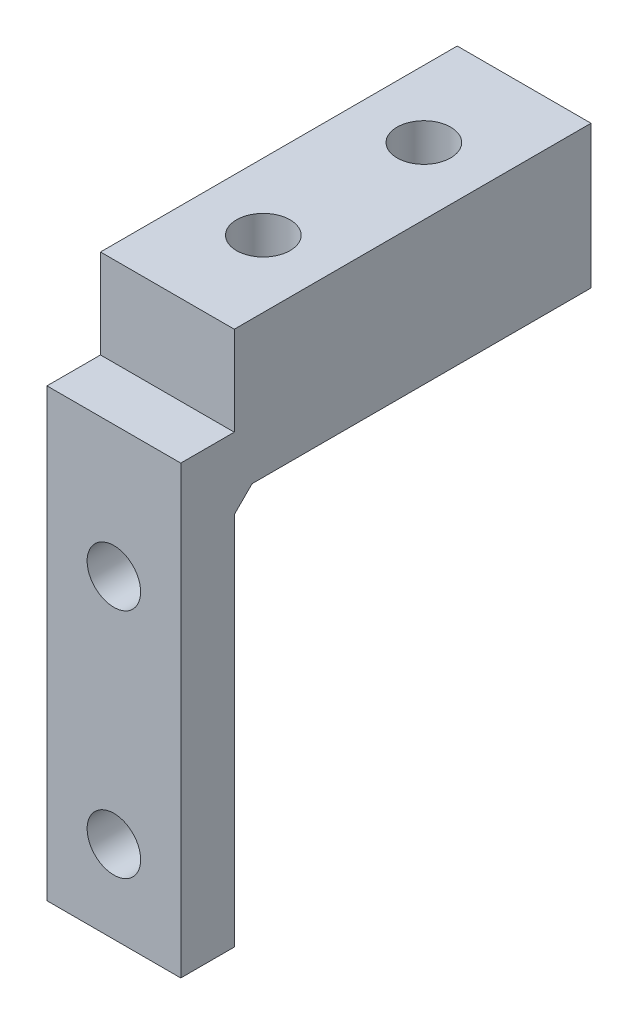
ISO-10303-21;
HEADER;
FILE_DESCRIPTION(('STEP AP214'),'2;1');
FILE_NAME('part.step','',(''),(''),'','','');
FILE_SCHEMA(('AUTOMOTIVE_DESIGN { 1 0 10303 214 1 1 1 1 }'));
ENDSEC;
DATA;
#1=APPLICATION_CONTEXT('core data for automotive mechanical design processes');
#2=APPLICATION_PROTOCOL_DEFINITION('international standard','automotive_design',2000,#1);
#3=PRODUCT_CONTEXT('',#1,'mechanical');
#4=PRODUCT('Part','Part','',(#3));
#5=PRODUCT_RELATED_PRODUCT_CATEGORY('part','',(#4));
#6=PRODUCT_DEFINITION_FORMATION('','',#4);
#7=PRODUCT_DEFINITION_CONTEXT('part definition',#1,'design');
#8=PRODUCT_DEFINITION('design','',#6,#7);
#9=PRODUCT_DEFINITION_SHAPE('','',#8);
#10=(LENGTH_UNIT() NAMED_UNIT(*) SI_UNIT(.MILLI.,.METRE.));
#11=(NAMED_UNIT(*) PLANE_ANGLE_UNIT() SI_UNIT($,.RADIAN.));
#12=(NAMED_UNIT(*) SI_UNIT($,.STERADIAN.) SOLID_ANGLE_UNIT());
#13=UNCERTAINTY_MEASURE_WITH_UNIT(LENGTH_MEASURE(1.E-05),#10,'distance_accuracy_value','');
#14=(GEOMETRIC_REPRESENTATION_CONTEXT(3) GLOBAL_UNCERTAINTY_ASSIGNED_CONTEXT((#13)) GLOBAL_UNIT_ASSIGNED_CONTEXT((#10,
#11,#12)) REPRESENTATION_CONTEXT('',''));
#15=CARTESIAN_POINT('',(0.,0.,0.));
#16=DIRECTION('',(0.,0.,1.));
#17=DIRECTION('',(1.,0.,0.));
#18=AXIS2_PLACEMENT_3D('',#15,#16,#17);
#19=CARTESIAN_POINT('',(17.7401409776573,2.32150758974876,-17.377692950586));
#20=DIRECTION('',(-4.94162912521759E-09,-1.,0.));
#21=DIRECTION('',(-1.,4.94162912521759E-09,0.));
#22=AXIS2_PLACEMENT_3D('',#19,#20,#21);
#23=CYLINDRICAL_SURFACE('',#22,1.5);
#24=CARTESIAN_POINT('',(17.7401409381243,-5.67849241025123,-17.3776929505858));
#25=DIRECTION('',(4.94162681225285E-09,1.,0.));
#26=DIRECTION('',(0.,0.,1.));
#27=AXIS2_PLACEMENT_3D('',#24,#25,#26);
#28=CIRCLE('',#27,1.49999999999998);
#29=CARTESIAN_POINT('',(17.7401409381243,-5.6784924102512,-15.8776929505858));
#30=VERTEX_POINT('',#29);
#31=EDGE_CURVE('E180',#30,#30,#28,.T.);
#32=ORIENTED_EDGE('',*,*,#31,.F.);
#33=DIRECTION('',(4.9416258003309E-09,1.,0.));
#34=VECTOR('',#33,1.);
#35=CARTESIAN_POINT('',(17.7401409578908,-1.6784924102512,-15.8776929505859));
#36=LINE('',#35,#34);
#37=CARTESIAN_POINT('',(17.7401409776573,2.32150758974879,-15.877692950586));
#38=VERTEX_POINT('',#37);
#39=EDGE_CURVE('E11',#30,#38,#36,.T.);
#40=ORIENTED_EDGE('',*,*,#39,.T.);
#41=CARTESIAN_POINT('',(17.7401409776573,2.32150758974876,-17.377692950586));
#42=DIRECTION('',(-4.94162652313236E-09,-1.,0.));
#43=DIRECTION('',(0.,0.,1.));
#44=AXIS2_PLACEMENT_3D('',#41,#42,#43);
#45=CIRCLE('',#44,1.5);
#46=EDGE_CURVE('E51',#38,#38,#45,.T.);
#47=ORIENTED_EDGE('',*,*,#46,.F.);
#48=ORIENTED_EDGE('',*,*,#39,.F.);
#49=EDGE_LOOP('',(#32,#40,#47,#48));
#50=FACE_BOUND('',#49,.T.);
#51=ADVANCED_FACE('F40',(#50),#23,.F.);
#52=CARTESIAN_POINT('',(13.9899028314246,2.33150760828143,0.00999988247295892));
#53=DIRECTION('',(-1.,4.94162721415864E-09,0.));
#54=DIRECTION('',(0.,0.,-1.));
#55=AXIS2_PLACEMENT_3D('',#52,#53,#54);
#56=PLANE('',#55);
#57=DIRECTION('',(-4.9416212938464E-09,-1.,0.));
#58=VECTOR('',#57,1.);
#59=CARTESIAN_POINT('',(13.9899028190211,-0.178492258156639,-3.));
#60=LINE('',#59,#58);
#61=CARTESIAN_POINT('',(13.9899028313752,2.32150760828137,-3.));
#62=VERTEX_POINT('',#61);
#63=CARTESIAN_POINT('',(13.9899028313752,-2.67849212459464,-3.00000011752693));
#64=VERTEX_POINT('',#63);
#65=EDGE_CURVE('E333',#62,#64,#60,.T.);
#66=ORIENTED_EDGE('',*,*,#65,.F.);
#67=DIRECTION('',(0.,0.,1.));
#68=VECTOR('',#67,1.);
#69=CARTESIAN_POINT('',(13.9899028313752,2.32150760828114,-12.999846475293));
#70=LINE('',#69,#68);
#71=CARTESIAN_POINT('',(13.9899028313752,2.32150760828091,-22.999692950586));
#72=VERTEX_POINT('',#71);
#73=EDGE_CURVE('E353',#72,#62,#70,.T.);
#74=ORIENTED_EDGE('',*,*,#73,.F.);
#75=DIRECTION('',(-4.94162601717133E-09,-1.,0.));
#76=VECTOR('',#75,1.);
#77=CARTESIAN_POINT('',(13.9899028116087,-1.67849239171909,-22.9996929505859));
#78=LINE('',#77,#76);
#79=CARTESIAN_POINT('',(13.9899027918422,-5.67849239171908,-22.9996929505858));
#80=VERTEX_POINT('',#79);
#81=EDGE_CURVE('E219',#72,#80,#78,.T.);
#82=ORIENTED_EDGE('',*,*,#81,.T.);
#83=DIRECTION('',(0.,0.,-1.));
#84=VECTOR('',#83,1.);
#85=CARTESIAN_POINT('',(13.9899027918422,-5.67849239171887,-13.4998464752929));
#86=LINE('',#85,#84);
#87=CARTESIAN_POINT('',(13.9899027918422,-5.67849239171865,-4.));
#88=VERTEX_POINT('',#87);
#89=EDGE_CURVE('E189',#88,#80,#86,.T.);
#90=ORIENTED_EDGE('',*,*,#89,.F.);
#91=DIRECTION('',(3.49423922597153E-09,0.707106822738547,-0.707106739634545));
#92=VECTOR('',#91,1.);
#93=CARTESIAN_POINT('',(13.9899027893714,-6.17849239171864,-3.50000005876341));
#94=LINE('',#93,#92);
#95=CARTESIAN_POINT('',(13.9899028116087,-6.67849239171862,-3.00000011752683));
#96=VERTEX_POINT('',#95);
#97=EDGE_CURVE('E44',#96,#88,#94,.T.);
#98=ORIENTED_EDGE('',*,*,#97,.F.);
#99=DIRECTION('',(4.94162565754752E-09,1.,0.));
#100=VECTOR('',#99,1.);
#101=CARTESIAN_POINT('',(13.9899027597224,-17.1783388065658,-3.00000011752659));
#102=LINE('',#101,#100);
#103=CARTESIAN_POINT('',(13.9899027078361,-27.6781852214129,-3.00000011752635));
#104=VERTEX_POINT('',#103);
#105=EDGE_CURVE('E165',#104,#96,#102,.T.);
#106=ORIENTED_EDGE('',*,*,#105,.F.);
#107=DIRECTION('',(0.,0.,1.));
#108=VECTOR('',#107,1.);
#109=CARTESIAN_POINT('',(13.9899026831279,-27.6781852214129,-1.50000011752635));
#110=LINE('',#109,#108);
#111=CARTESIAN_POINT('',(13.9899027078361,-27.6781852214128,-1.17526360704134E-07));
#112=VERTEX_POINT('',#111);
#113=EDGE_CURVE('E289',#104,#112,#110,.T.);
#114=ORIENTED_EDGE('',*,*,#113,.T.);
#115=DIRECTION('',(-4.94162569698124E-09,-1.,0.));
#116=VECTOR('',#115,1.);
#117=CARTESIAN_POINT('',(13.9899027696056,-15.1783386730037,-1.17526647216915E-07));
#118=LINE('',#117,#116);
#119=CARTESIAN_POINT('',(13.9899028313752,-2.67849212459464,-1.17526933767847E-07));
#120=VERTEX_POINT('',#119);
#121=EDGE_CURVE('E286',#120,#112,#118,.T.);
#122=ORIENTED_EDGE('',*,*,#121,.F.);
#123=DIRECTION('',(0.,0.,1.));
#124=VECTOR('',#123,1.);
#125=CARTESIAN_POINT('',(13.9899028313752,-2.67849212459464,-1.50000011752693));
#126=LINE('',#125,#124);
#127=EDGE_CURVE('E317',#64,#120,#126,.T.);
#128=ORIENTED_EDGE('',*,*,#127,.F.);
#129=EDGE_LOOP('',(#66,#74,#82,#90,#98,#106,#114,#122,#128));
#130=FACE_BOUND('',#129,.T.);
#131=ADVANCED_FACE('F216',(#130),#56,.T.);
#132=CARTESIAN_POINT('',(21.4999028313752,2.32150757116975,-2.99));
#133=DIRECTION('',(4.94162604715989E-09,1.,0.));
#134=DIRECTION('',(0.,0.,-1.));
#135=AXIS2_PLACEMENT_3D('',#132,#133,#134);
#136=PLANE('',#135);
#137=ORIENTED_EDGE('',*,*,#46,.T.);
#138=EDGE_LOOP('',(#137));
#139=FACE_BOUND('',#138,.T.);
#140=CARTESIAN_POINT('',(17.7401409776573,2.32150758974896,-8.37769295058599));
#141=DIRECTION('',(-4.94162970345868E-09,-1.,0.));
#142=DIRECTION('',(0.,0.,1.));
#143=AXIS2_PLACEMENT_3D('',#140,#141,#142);
#144=CIRCLE('',#143,1.5);
#145=CARTESIAN_POINT('',(17.7401409776573,2.32150758974899,-6.877692950586));
#146=VERTEX_POINT('',#145);
#147=EDGE_CURVE('E350',#146,#146,#144,.T.);
#148=ORIENTED_EDGE('',*,*,#147,.T.);
#149=EDGE_LOOP('',(#148));
#150=FACE_BOUND('',#149,.T.);
#151=DIRECTION('',(-1.,4.94162634965999E-09,0.));
#152=VECTOR('',#151,1.);
#153=CARTESIAN_POINT('',(17.7399028313752,2.32150758974981,-22.999692950586));
#154=LINE('',#153,#152);
#155=CARTESIAN_POINT('',(21.4899028313752,2.32150757121871,-22.999692950586));
#156=VERTEX_POINT('',#155);
#157=EDGE_CURVE('E344',#156,#72,#154,.T.);
#158=ORIENTED_EDGE('',*,*,#157,.T.);
#159=ORIENTED_EDGE('',*,*,#73,.T.);
#160=DIRECTION('',(-1.,4.94162767961466E-09,0.));
#161=VECTOR('',#160,1.);
#162=CARTESIAN_POINT('',(17.7399028313752,2.32150758975026,-3.));
#163=LINE('',#162,#161);
#164=CARTESIAN_POINT('',(21.4899028313752,2.32150757121916,-3.));
#165=VERTEX_POINT('',#164);
#166=EDGE_CURVE('E329',#165,#62,#163,.T.);
#167=ORIENTED_EDGE('',*,*,#166,.F.);
#168=DIRECTION('',(0.,0.,-1.));
#169=VECTOR('',#168,1.);
#170=CARTESIAN_POINT('',(21.4899028313752,2.32150757121893,-12.999846475293));
#171=LINE('',#170,#169);
#172=EDGE_CURVE('E339',#165,#156,#171,.T.);
#173=ORIENTED_EDGE('',*,*,#172,.T.);
#174=EDGE_LOOP('',(#158,#159,#167,#173));
#175=FACE_BOUND('',#174,.T.);
#176=ADVANCED_FACE('F236',(#139,#150,#175),#136,.T.);
#177=CARTESIAN_POINT('',(17.7401409776573,2.32150758974896,-8.37769295058601));
#178=DIRECTION('',(-4.94162739049412E-09,-1.,0.));
#179=DIRECTION('',(-1.,4.94162739049412E-09,0.));
#180=AXIS2_PLACEMENT_3D('',#177,#178,#179);
#181=CYLINDRICAL_SURFACE('',#180,1.5);
#182=CARTESIAN_POINT('',(17.7401409381243,-5.67849241025102,-8.37769295058583));
#183=DIRECTION('',(4.94162912521758E-09,1.,0.));
#184=DIRECTION('',(0.,0.,1.));
#185=AXIS2_PLACEMENT_3D('',#182,#183,#184);
#186=CIRCLE('',#185,1.50000000000001);
#187=CARTESIAN_POINT('',(17.7401409381243,-5.678492410251,-6.87769295058582));
#188=VERTEX_POINT('',#187);
#189=EDGE_CURVE('E176',#188,#188,#186,.T.);
#190=ORIENTED_EDGE('',*,*,#189,.F.);
#191=DIRECTION('',(4.9416258003309E-09,1.,0.));
#192=VECTOR('',#191,1.);
#193=CARTESIAN_POINT('',(17.7401409578908,-1.678492410251,-6.87769295058591));
#194=LINE('',#193,#192);
#195=EDGE_CURVE('E347',#188,#146,#194,.T.);
#196=ORIENTED_EDGE('',*,*,#195,.T.);
#197=ORIENTED_EDGE('',*,*,#147,.F.);
#198=ORIENTED_EDGE('',*,*,#195,.F.);
#199=EDGE_LOOP('',(#190,#196,#197,#198));
#200=FACE_BOUND('',#199,.T.);
#201=ADVANCED_FACE('F241',(#200),#181,.F.);
#202=CARTESIAN_POINT('',(13.9799028314246,2.33150760833033,-22.999692950586));
#203=DIRECTION('',(0.,0.,-1.));
#204=DIRECTION('',(1.,-4.94162731590712E-09,0.));
#205=AXIS2_PLACEMENT_3D('',#202,#203,#204);
#206=PLANE('',#205);
#207=DIRECTION('',(1.,-4.94162773743877E-09,0.));
#208=VECTOR('',#207,1.);
#209=CARTESIAN_POINT('',(17.7399027918422,-5.67849241025019,-22.9996929505858));
#210=LINE('',#209,#208);
#211=CARTESIAN_POINT('',(21.4899027918422,-5.67849242878129,-22.9996929505858));
#212=VERTEX_POINT('',#211);
#213=EDGE_CURVE('E186',#80,#212,#210,.T.);
#214=ORIENTED_EDGE('',*,*,#213,.F.);
#215=ORIENTED_EDGE('',*,*,#81,.F.);
#216=ORIENTED_EDGE('',*,*,#157,.F.);
#217=DIRECTION('',(4.94162580033089E-09,1.,0.));
#218=VECTOR('',#217,1.);
#219=CARTESIAN_POINT('',(21.4899028116087,-1.67849242878129,-22.9996929505859));
#220=LINE('',#219,#218);
#221=EDGE_CURVE('E336',#212,#156,#220,.T.);
#222=ORIENTED_EDGE('',*,*,#221,.F.);
#223=EDGE_LOOP('',(#214,#215,#216,#222));
#224=FACE_BOUND('',#223,.T.);
#225=ADVANCED_FACE('F245',(#224),#206,.T.);
#226=CARTESIAN_POINT('',(21.4899028314246,2.33150757121871,-23.009692950586));
#227=DIRECTION('',(1.,-4.94162715637246E-09,0.));
#228=DIRECTION('',(0.,0.,1.));
#229=AXIS2_PLACEMENT_3D('',#226,#227,#228);
#230=PLANE('',#229);
#231=ORIENTED_EDGE('',*,*,#221,.T.);
#232=ORIENTED_EDGE('',*,*,#172,.F.);
#233=DIRECTION('',(4.94162129384641E-09,1.,0.));
#234=VECTOR('',#233,1.);
#235=CARTESIAN_POINT('',(21.4899028190211,-0.178492295218842,-3.));
#236=LINE('',#235,#234);
#237=CARTESIAN_POINT('',(21.4899028313752,-2.67849216165684,-3.00000011752693));
#238=VERTEX_POINT('',#237);
#239=EDGE_CURVE('E325',#238,#165,#236,.T.);
#240=ORIENTED_EDGE('',*,*,#239,.F.);
#241=DIRECTION('',(0.,0.,-1.));
#242=VECTOR('',#241,1.);
#243=CARTESIAN_POINT('',(21.4899028313752,-2.67849216165684,-1.50000011752693));
#244=LINE('',#243,#242);
#245=CARTESIAN_POINT('',(21.4899028313752,-2.67849216165684,-1.17526933936711E-07));
#246=VERTEX_POINT('',#245);
#247=EDGE_CURVE('E295',#246,#238,#244,.T.);
#248=ORIENTED_EDGE('',*,*,#247,.F.);
#249=DIRECTION('',(4.94162562759145E-09,1.,0.));
#250=VECTOR('',#249,1.);
#251=CARTESIAN_POINT('',(21.4899027696056,-15.1783387100659,-1.17526647277088E-07));
#252=LINE('',#251,#250);
#253=CARTESIAN_POINT('',(21.4899027078361,-27.678185258475,-1.17526360734221E-07));
#254=VERTEX_POINT('',#253);
#255=EDGE_CURVE('E162',#254,#246,#252,.T.);
#256=ORIENTED_EDGE('',*,*,#255,.F.);
#257=DIRECTION('',(0.,0.,-1.));
#258=VECTOR('',#257,1.);
#259=CARTESIAN_POINT('',(21.4899026831279,-27.6781852584751,-1.50000011752635));
#260=LINE('',#259,#258);
#261=CARTESIAN_POINT('',(21.4899027078361,-27.6781852584751,-3.00000011752635));
#262=VERTEX_POINT('',#261);
#263=EDGE_CURVE('E147',#254,#262,#260,.T.);
#264=ORIENTED_EDGE('',*,*,#263,.T.);
#265=DIRECTION('',(-4.94162557494043E-09,-1.,0.));
#266=VECTOR('',#265,1.);
#267=CARTESIAN_POINT('',(21.4899027597224,-17.178338843628,-3.00000011752659));
#268=LINE('',#267,#266);
#269=CARTESIAN_POINT('',(21.4899028116087,-6.67849242878083,-3.00000011752683));
#270=VERTEX_POINT('',#269);
#271=EDGE_CURVE('E87',#270,#262,#268,.T.);
#272=ORIENTED_EDGE('',*,*,#271,.F.);
#273=DIRECTION('',(-3.49423922597151E-09,-0.707106822738551,0.707106739634542));
#274=VECTOR('',#273,1.);
#275=CARTESIAN_POINT('',(21.4899027893714,-6.17849242878084,-3.50000005876341));
#276=LINE('',#275,#274);
#277=CARTESIAN_POINT('',(21.4899027918422,-5.67849242878086,-4.));
#278=VERTEX_POINT('',#277);
#279=EDGE_CURVE('E197',#278,#270,#276,.T.);
#280=ORIENTED_EDGE('',*,*,#279,.F.);
#281=DIRECTION('',(0.,0.,1.));
#282=VECTOR('',#281,1.);
#283=CARTESIAN_POINT('',(21.4899027918422,-5.67849242878108,-13.4998464752929));
#284=LINE('',#283,#282);
#285=EDGE_CURVE('E98',#212,#278,#284,.T.);
#286=ORIENTED_EDGE('',*,*,#285,.F.);
#287=EDGE_LOOP('',(#231,#232,#240,#248,#256,#264,#272,#280,#286));
#288=FACE_BOUND('',#287,.T.);
#289=ADVANCED_FACE('F249',(#288),#230,.T.);
#290=CARTESIAN_POINT('',(13.9799028066671,2.33150760828137,-3.));
#291=DIRECTION('',(0.,0.,1.));
#292=DIRECTION('',(0.,-1.,0.));
#293=AXIS2_PLACEMENT_3D('',#290,#291,#292);
#294=PLANE('',#293);
#295=DIRECTION('',(1.,-4.94162634965999E-09,0.));
#296=VECTOR('',#295,1.);
#297=CARTESIAN_POINT('',(17.7399028313752,-2.67849214312574,-3.));
#298=LINE('',#297,#296);
#299=EDGE_CURVE('E313',#64,#238,#298,.T.);
#300=ORIENTED_EDGE('',*,*,#299,.T.);
#301=ORIENTED_EDGE('',*,*,#239,.T.);
#302=ORIENTED_EDGE('',*,*,#166,.T.);
#303=ORIENTED_EDGE('',*,*,#65,.T.);
#304=EDGE_LOOP('',(#300,#301,#302,#303));
#305=FACE_BOUND('',#304,.T.);
#306=ADVANCED_FACE('F253',(#305),#294,.T.);
#307=CARTESIAN_POINT('',(17.7401408917832,-23.0561852399452,-3.00000011752653));
#308=DIRECTION('',(0.,0.,1.));
#309=DIRECTION('',(0.,-1.,0.));
#310=AXIS2_PLACEMENT_3D('',#307,#308,#309);
#311=CYLINDRICAL_SURFACE('',#310,1.50000000000001);
#312=CARTESIAN_POINT('',(17.7401408917832,-23.0561852399451,-1.17526537390944E-07));
#313=DIRECTION('',(0.,0.,-1.));
#314=DIRECTION('',(4.94166150672241E-09,1.,0.));
#315=AXIS2_PLACEMENT_3D('',#312,#313,#314);
#316=CIRCLE('',#315,1.5);
#317=CARTESIAN_POINT('',(17.7401408991957,-21.5561852399451,-1.17526571807858E-07));
#318=VERTEX_POINT('',#317);
#319=EDGE_CURVE('E278',#318,#318,#316,.T.);
#320=ORIENTED_EDGE('',*,*,#319,.F.);
#321=DIRECTION('',(0.,0.,-1.));
#322=VECTOR('',#321,1.);
#323=CARTESIAN_POINT('',(17.7401408991957,-21.5561852399452,-1.50000011752657));
#324=LINE('',#323,#322);
#325=CARTESIAN_POINT('',(17.7401408991957,-21.5561852399452,-3.00000011752656));
#326=VERTEX_POINT('',#325);
#327=EDGE_CURVE('E146',#318,#326,#324,.T.);
#328=ORIENTED_EDGE('',*,*,#327,.T.);
#329=CARTESIAN_POINT('',(17.7401408917832,-23.0561852399452,-3.00000011752653));
#330=DIRECTION('',(0.,0.,1.));
#331=DIRECTION('',(4.94165919375782E-09,1.,0.));
#332=AXIS2_PLACEMENT_3D('',#329,#330,#331);
#333=CIRCLE('',#332,1.5);
#334=EDGE_CURVE('E154',#326,#326,#333,.T.);
#335=ORIENTED_EDGE('',*,*,#334,.F.);
#336=ORIENTED_EDGE('',*,*,#327,.F.);
#337=EDGE_LOOP('',(#320,#328,#335,#336));
#338=FACE_BOUND('',#337,.T.);
#339=ADVANCED_FACE('F256',(#338),#311,.F.);
#340=CARTESIAN_POINT('',(17.7401409362578,-10.0561852399451,-3.00000011752674));
#341=DIRECTION('',(0.,0.,1.));
#342=DIRECTION('',(0.,-1.,0.));
#343=AXIS2_PLACEMENT_3D('',#340,#341,#342);
#344=CYLINDRICAL_SURFACE('',#343,1.49999999999994);
#345=CARTESIAN_POINT('',(17.7401409362578,-10.0561852399451,-1.17526742782203E-07));
#346=DIRECTION('',(0.,0.,-1.));
#347=DIRECTION('',(4.94163143818221E-09,1.,0.));
#348=AXIS2_PLACEMENT_3D('',#345,#346,#347);
#349=CIRCLE('',#348,1.50000000000002);
#350=CARTESIAN_POINT('',(17.7401409436703,-8.55618523994513,-1.17526777199117E-07));
#351=VERTEX_POINT('',#350);
#352=EDGE_CURVE('E144',#351,#351,#349,.T.);
#353=ORIENTED_EDGE('',*,*,#352,.F.);
#354=DIRECTION('',(0.,0.,-1.));
#355=VECTOR('',#354,1.);
#356=CARTESIAN_POINT('',(17.7401409436703,-8.55618523994516,-1.50000011752677));
#357=LINE('',#356,#355);
#358=CARTESIAN_POINT('',(17.7401409436703,-8.5561852399452,-3.00000011752677));
#359=VERTEX_POINT('',#358);
#360=EDGE_CURVE('E139',#351,#359,#357,.T.);
#361=ORIENTED_EDGE('',*,*,#360,.T.);
#362=CARTESIAN_POINT('',(17.7401409362578,-10.0561852399451,-3.00000011752674));
#363=DIRECTION('',(0.,0.,1.));
#364=DIRECTION('',(4.94162912521781E-09,1.,0.));
#365=AXIS2_PLACEMENT_3D('',#362,#363,#364);
#366=CIRCLE('',#365,1.49999999999994);
#367=EDGE_CURVE('E142',#359,#359,#366,.T.);
#368=ORIENTED_EDGE('',*,*,#367,.F.);
#369=ORIENTED_EDGE('',*,*,#360,.F.);
#370=EDGE_LOOP('',(#353,#361,#368,#369));
#371=FACE_BOUND('',#370,.T.);
#372=ADVANCED_FACE('F141',(#371),#344,.F.);
#373=CARTESIAN_POINT('',(13.9799026831279,-27.6781852213635,-3.01000011752635));
#374=DIRECTION('',(-4.94162332041795E-09,-1.,0.));
#375=DIRECTION('',(1.,-4.94162332041795E-09,0.));
#376=AXIS2_PLACEMENT_3D('',#373,#374,#375);
#377=PLANE('',#376);
#378=DIRECTION('',(1.,-4.94162773743877E-09,0.));
#379=VECTOR('',#378,1.);
#380=CARTESIAN_POINT('',(17.7399027078361,-27.6781852399439,-1.17526360292053E-07));
#381=LINE('',#380,#379);
#382=EDGE_CURVE('E153',#112,#254,#381,.T.);
#383=ORIENTED_EDGE('',*,*,#382,.F.);
#384=ORIENTED_EDGE('',*,*,#113,.F.);
#385=DIRECTION('',(-1.,4.94162773743877E-09,0.));
#386=VECTOR('',#385,1.);
#387=CARTESIAN_POINT('',(17.7399027078361,-27.678185239944,-3.00000011752635));
#388=LINE('',#387,#386);
#389=EDGE_CURVE('E171',#262,#104,#388,.T.);
#390=ORIENTED_EDGE('',*,*,#389,.F.);
#391=ORIENTED_EDGE('',*,*,#263,.F.);
#392=EDGE_LOOP('',(#383,#384,#390,#391));
#393=FACE_BOUND('',#392,.T.);
#394=ADVANCED_FACE('F263',(#393),#377,.T.);
#395=CARTESIAN_POINT('',(13.9799028165009,-2.67849212454522,-3.01000011747751));
#396=DIRECTION('',(4.94162730616522E-09,1.,0.));
#397=DIRECTION('',(4.94162226684351E-09,0.,1.));
#398=AXIS2_PLACEMENT_3D('',#395,#396,#397);
#399=PLANE('',#398);
#400=DIRECTION('',(1.,-4.94162634965999E-09,0.));
#401=VECTOR('',#400,1.);
#402=CARTESIAN_POINT('',(17.7399028313752,-2.67849214312574,-1.17526934150672E-07));
#403=LINE('',#402,#401);
#404=EDGE_CURVE('E298',#120,#246,#403,.T.);
#405=ORIENTED_EDGE('',*,*,#404,.T.);
#406=ORIENTED_EDGE('',*,*,#247,.T.);
#407=ORIENTED_EDGE('',*,*,#299,.F.);
#408=ORIENTED_EDGE('',*,*,#127,.T.);
#409=EDGE_LOOP('',(#405,#406,#407,#408));
#410=FACE_BOUND('',#409,.T.);
#411=ADVANCED_FACE('F266',(#410),#399,.T.);
#412=CARTESIAN_POINT('',(21.4999027077867,-27.6881852585244,-1.175263602492E-07));
#413=DIRECTION('',(0.,0.,1.));
#414=DIRECTION('',(4.94162444523266E-09,1.,0.));
#415=AXIS2_PLACEMENT_3D('',#412,#413,#414);
#416=PLANE('',#415);
#417=ORIENTED_EDGE('',*,*,#319,.T.);
#418=EDGE_LOOP('',(#417));
#419=FACE_BOUND('',#418,.T.);
#420=ORIENTED_EDGE('',*,*,#352,.T.);
#421=EDGE_LOOP('',(#420));
#422=FACE_BOUND('',#421,.T.);
#423=ORIENTED_EDGE('',*,*,#382,.T.);
#424=ORIENTED_EDGE('',*,*,#255,.T.);
#425=ORIENTED_EDGE('',*,*,#404,.F.);
#426=ORIENTED_EDGE('',*,*,#121,.T.);
#427=EDGE_LOOP('',(#423,#424,#425,#426));
#428=FACE_BOUND('',#427,.T.);
#429=ADVANCED_FACE('F228',(#419,#422,#428),#416,.T.);
#430=CARTESIAN_POINT('',(21.4999028116581,-6.66849242883024,-3.00000011752683));
#431=DIRECTION('',(0.,0.,-1.));
#432=DIRECTION('',(-4.9416243326885E-09,-1.,0.));
#433=AXIS2_PLACEMENT_3D('',#430,#431,#432);
#434=PLANE('',#433);
#435=ORIENTED_EDGE('',*,*,#367,.T.);
#436=EDGE_LOOP('',(#435));
#437=FACE_BOUND('',#436,.T.);
#438=ORIENTED_EDGE('',*,*,#334,.T.);
#439=EDGE_LOOP('',(#438));
#440=FACE_BOUND('',#439,.T.);
#441=DIRECTION('',(-1.,4.941627853087E-09,0.));
#442=VECTOR('',#441,1.);
#443=CARTESIAN_POINT('',(17.7399028116087,-6.67849241024973,-3.00000011752683));
#444=LINE('',#443,#442);
#445=EDGE_CURVE('E193',#270,#96,#444,.T.);
#446=ORIENTED_EDGE('',*,*,#445,.F.);
#447=ORIENTED_EDGE('',*,*,#271,.T.);
#448=ORIENTED_EDGE('',*,*,#389,.T.);
#449=ORIENTED_EDGE('',*,*,#105,.T.);
#450=EDGE_LOOP('',(#446,#447,#448,#449));
#451=FACE_BOUND('',#450,.T.);
#452=ADVANCED_FACE('F150',(#437,#440,#451),#434,.T.);
#453=CARTESIAN_POINT('',(21.4999027918422,-5.6784924288307,-23.0096929505858));
#454=DIRECTION('',(-4.94162610483022E-09,-1.,0.));
#455=DIRECTION('',(0.,0.,1.));
#456=AXIS2_PLACEMENT_3D('',#453,#454,#455);
#457=PLANE('',#456);
#458=ORIENTED_EDGE('',*,*,#189,.T.);
#459=EDGE_LOOP('',(#458));
#460=FACE_BOUND('',#459,.T.);
#461=ORIENTED_EDGE('',*,*,#31,.T.);
#462=EDGE_LOOP('',(#461));
#463=FACE_BOUND('',#462,.T.);
#464=DIRECTION('',(1.,-4.94162646530822E-09,0.));
#465=VECTOR('',#464,1.);
#466=CARTESIAN_POINT('',(17.7399027918422,-5.67849241024975,-4.));
#467=LINE('',#466,#465);
#468=EDGE_CURVE('E200',#88,#278,#467,.T.);
#469=ORIENTED_EDGE('',*,*,#468,.F.);
#470=ORIENTED_EDGE('',*,*,#89,.T.);
#471=ORIENTED_EDGE('',*,*,#213,.T.);
#472=ORIENTED_EDGE('',*,*,#285,.T.);
#473=EDGE_LOOP('',(#469,#470,#471,#472));
#474=FACE_BOUND('',#473,.T.);
#475=ADVANCED_FACE('F221',(#460,#463,#474),#457,.T.);
#476=CARTESIAN_POINT('',(13.9799027869006,-6.6855634784524,-2.99292903157468));
#477=DIRECTION('',(-3.49425821447277E-09,-0.707106739634546,-0.707106822738547));
#478=DIRECTION('',(0.,0.707106822738547,-0.707106739634546));
#479=AXIS2_PLACEMENT_3D('',#476,#477,#478);
#480=PLANE('',#479);
#481=ORIENTED_EDGE('',*,*,#97,.T.);
#482=ORIENTED_EDGE('',*,*,#468,.T.);
#483=ORIENTED_EDGE('',*,*,#279,.T.);
#484=ORIENTED_EDGE('',*,*,#445,.T.);
#485=EDGE_LOOP('',(#481,#482,#483,#484));
#486=FACE_BOUND('',#485,.T.);
#487=ADVANCED_FACE('F42',(#486),#480,.T.);
#488=CLOSED_SHELL('',(#51,#131,#176,#201,#225,#289,#306,#339,#372,#394,#411,#429,#452,#475,#487));
#489=MANIFOLD_SOLID_BREP('B2',#488);
#490=ADVANCED_BREP_SHAPE_REPRESENTATION('',(#18,#489),#14);
#491=SHAPE_DEFINITION_REPRESENTATION(#9,#490);
ENDSEC;
END-ISO-10303-21;
